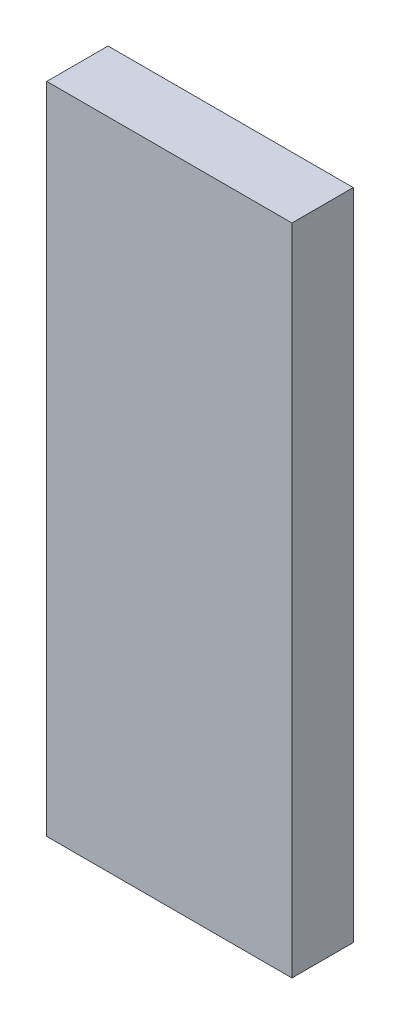
ISO-10303-21;
HEADER;
FILE_DESCRIPTION(('STEP AP214'),'2;1');
FILE_NAME('part.step','',(''),(''),'','','');
FILE_SCHEMA(('AUTOMOTIVE_DESIGN { 1 0 10303 214 1 1 1 1 }'));
ENDSEC;
DATA;
#1=APPLICATION_CONTEXT('core data for automotive mechanical design processes');
#2=APPLICATION_PROTOCOL_DEFINITION('international standard','automotive_design',2000,#1);
#3=PRODUCT_CONTEXT('',#1,'mechanical');
#4=PRODUCT('Part','Part','',(#3));
#5=PRODUCT_RELATED_PRODUCT_CATEGORY('part','',(#4));
#6=PRODUCT_DEFINITION_FORMATION('','',#4);
#7=PRODUCT_DEFINITION_CONTEXT('part definition',#1,'design');
#8=PRODUCT_DEFINITION('design','',#6,#7);
#9=PRODUCT_DEFINITION_SHAPE('','',#8);
#10=(LENGTH_UNIT() NAMED_UNIT(*) SI_UNIT(.MILLI.,.METRE.));
#11=(NAMED_UNIT(*) PLANE_ANGLE_UNIT() SI_UNIT($,.RADIAN.));
#12=(NAMED_UNIT(*) SI_UNIT($,.STERADIAN.) SOLID_ANGLE_UNIT());
#13=UNCERTAINTY_MEASURE_WITH_UNIT(LENGTH_MEASURE(1.E-05),#10,'distance_accuracy_value','');
#14=(GEOMETRIC_REPRESENTATION_CONTEXT(3) GLOBAL_UNCERTAINTY_ASSIGNED_CONTEXT((#13)) GLOBAL_UNIT_ASSIGNED_CONTEXT((#10,
#11,#12)) REPRESENTATION_CONTEXT('',''));
#15=CARTESIAN_POINT('',(0.,0.,0.));
#16=DIRECTION('',(0.,0.,1.));
#17=DIRECTION('',(1.,0.,0.));
#18=AXIS2_PLACEMENT_3D('',#15,#16,#17);
#19=CARTESIAN_POINT('',(62.5858711935384,-164.,3.));
#20=DIRECTION('',(1.,0.,0.));
#21=DIRECTION('',(0.,0.,-1.));
#22=AXIS2_PLACEMENT_3D('',#19,#20,#21);
#23=PLANE('',#22);
#24=DIRECTION('',(0.,-1.,0.));
#25=VECTOR('',#24,1.);
#26=CARTESIAN_POINT('',(62.5858711935384,-164.,0.));
#27=LINE('',#26,#25);
#28=CARTESIAN_POINT('',(62.5858711935384,-164.,0.));
#29=VERTEX_POINT('',#28);
#30=CARTESIAN_POINT('',(62.5858711935384,-196.,0.));
#31=VERTEX_POINT('',#30);
#32=EDGE_CURVE('E96',#29,#31,#27,.T.);
#33=ORIENTED_EDGE('',*,*,#32,.T.);
#34=DIRECTION('',(0.,0.,-1.));
#35=VECTOR('',#34,1.);
#36=CARTESIAN_POINT('',(62.5858711935384,-196.,3.));
#37=LINE('',#36,#35);
#38=CARTESIAN_POINT('',(62.5858711935384,-196.,3.));
#39=VERTEX_POINT('',#38);
#40=EDGE_CURVE('E11',#39,#31,#37,.T.);
#41=ORIENTED_EDGE('',*,*,#40,.F.);
#42=DIRECTION('',(0.,-1.,0.));
#43=VECTOR('',#42,1.);
#44=CARTESIAN_POINT('',(62.5858711935384,-164.,3.));
#45=LINE('',#44,#43);
#46=CARTESIAN_POINT('',(62.5858711935384,-164.,3.));
#47=VERTEX_POINT('',#46);
#48=EDGE_CURVE('E84',#47,#39,#45,.T.);
#49=ORIENTED_EDGE('',*,*,#48,.F.);
#50=DIRECTION('',(0.,0.,-1.));
#51=VECTOR('',#50,1.);
#52=CARTESIAN_POINT('',(62.5858711935384,-164.,3.));
#53=LINE('',#52,#51);
#54=EDGE_CURVE('E92',#47,#29,#53,.T.);
#55=ORIENTED_EDGE('',*,*,#54,.T.);
#56=EDGE_LOOP('',(#33,#41,#49,#55));
#57=FACE_BOUND('',#56,.T.);
#58=ADVANCED_FACE('F33',(#57),#23,.F.);
#59=CARTESIAN_POINT('',(62.5858711935384,-196.,3.));
#60=DIRECTION('',(0.,1.,0.));
#61=DIRECTION('',(0.,0.,1.));
#62=AXIS2_PLACEMENT_3D('',#59,#60,#61);
#63=PLANE('',#62);
#64=DIRECTION('',(1.,0.,0.));
#65=VECTOR('',#64,1.);
#66=CARTESIAN_POINT('',(62.5858711935384,-196.,0.));
#67=LINE('',#66,#65);
#68=CARTESIAN_POINT('',(74.5858711935384,-196.,0.));
#69=VERTEX_POINT('',#68);
#70=EDGE_CURVE('E88',#31,#69,#67,.T.);
#71=ORIENTED_EDGE('',*,*,#70,.T.);
#72=DIRECTION('',(0.,0.,-1.));
#73=VECTOR('',#72,1.);
#74=CARTESIAN_POINT('',(74.5858711935384,-196.,3.));
#75=LINE('',#74,#73);
#76=CARTESIAN_POINT('',(74.5858711935384,-196.,3.));
#77=VERTEX_POINT('',#76);
#78=EDGE_CURVE('E41',#77,#69,#75,.T.);
#79=ORIENTED_EDGE('',*,*,#78,.F.);
#80=DIRECTION('',(1.,0.,0.));
#81=VECTOR('',#80,1.);
#82=CARTESIAN_POINT('',(62.5858711935384,-196.,3.));
#83=LINE('',#82,#81);
#84=EDGE_CURVE('E79',#39,#77,#83,.T.);
#85=ORIENTED_EDGE('',*,*,#84,.F.);
#86=ORIENTED_EDGE('',*,*,#40,.T.);
#87=EDGE_LOOP('',(#71,#79,#85,#86));
#88=FACE_BOUND('',#87,.T.);
#89=ADVANCED_FACE('F87',(#88),#63,.F.);
#90=CARTESIAN_POINT('',(74.5858711935384,-164.,3.));
#91=DIRECTION('',(-1.,0.,0.));
#92=DIRECTION('',(0.,-1.,0.));
#93=AXIS2_PLACEMENT_3D('',#90,#91,#92);
#94=PLANE('',#93);
#95=DIRECTION('',(0.,1.,0.));
#96=VECTOR('',#95,1.);
#97=CARTESIAN_POINT('',(74.5858711935384,-164.,0.));
#98=LINE('',#97,#96);
#99=CARTESIAN_POINT('',(74.5858711935384,-164.,0.));
#100=VERTEX_POINT('',#99);
#101=EDGE_CURVE('E66',#69,#100,#98,.T.);
#102=ORIENTED_EDGE('',*,*,#101,.T.);
#103=DIRECTION('',(0.,0.,-1.));
#104=VECTOR('',#103,1.);
#105=CARTESIAN_POINT('',(74.5858711935384,-164.,3.));
#106=LINE('',#105,#104);
#107=CARTESIAN_POINT('',(74.5858711935384,-164.,3.));
#108=VERTEX_POINT('',#107);
#109=EDGE_CURVE('E89',#108,#100,#106,.T.);
#110=ORIENTED_EDGE('',*,*,#109,.F.);
#111=DIRECTION('',(0.,1.,0.));
#112=VECTOR('',#111,1.);
#113=CARTESIAN_POINT('',(74.5858711935384,-164.,3.));
#114=LINE('',#113,#112);
#115=EDGE_CURVE('E82',#77,#108,#114,.T.);
#116=ORIENTED_EDGE('',*,*,#115,.F.);
#117=ORIENTED_EDGE('',*,*,#78,.T.);
#118=EDGE_LOOP('',(#102,#110,#116,#117));
#119=FACE_BOUND('',#118,.T.);
#120=ADVANCED_FACE('F90',(#119),#94,.F.);
#121=CARTESIAN_POINT('',(62.5858711935384,-164.,3.));
#122=DIRECTION('',(0.,-1.,0.));
#123=DIRECTION('',(0.,0.,-1.));
#124=AXIS2_PLACEMENT_3D('',#121,#122,#123);
#125=PLANE('',#124);
#126=DIRECTION('',(-1.,0.,0.));
#127=VECTOR('',#126,1.);
#128=CARTESIAN_POINT('',(62.5858711935384,-164.,0.));
#129=LINE('',#128,#127);
#130=EDGE_CURVE('E72',#100,#29,#129,.T.);
#131=ORIENTED_EDGE('',*,*,#130,.T.);
#132=ORIENTED_EDGE('',*,*,#54,.F.);
#133=DIRECTION('',(-1.,0.,0.));
#134=VECTOR('',#133,1.);
#135=CARTESIAN_POINT('',(62.5858711935384,-164.,3.));
#136=LINE('',#135,#134);
#137=EDGE_CURVE('E49',#108,#47,#136,.T.);
#138=ORIENTED_EDGE('',*,*,#137,.F.);
#139=ORIENTED_EDGE('',*,*,#109,.T.);
#140=EDGE_LOOP('',(#131,#132,#138,#139));
#141=FACE_BOUND('',#140,.T.);
#142=ADVANCED_FACE('F103',(#141),#125,.F.);
#143=CARTESIAN_POINT('',(0.,0.,3.));
#144=DIRECTION('',(0.,0.,1.));
#145=DIRECTION('',(1.,0.,0.));
#146=AXIS2_PLACEMENT_3D('',#143,#144,#145);
#147=PLANE('',#146);
#148=ORIENTED_EDGE('',*,*,#48,.T.);
#149=ORIENTED_EDGE('',*,*,#84,.T.);
#150=ORIENTED_EDGE('',*,*,#115,.T.);
#151=ORIENTED_EDGE('',*,*,#137,.T.);
#152=EDGE_LOOP('',(#148,#149,#150,#151));
#153=FACE_BOUND('',#152,.T.);
#154=ADVANCED_FACE('F80',(#153),#147,.T.);
#155=CARTESIAN_POINT('',(0.,0.,0.));
#156=DIRECTION('',(0.,0.,1.));
#157=DIRECTION('',(1.,0.,0.));
#158=AXIS2_PLACEMENT_3D('',#155,#156,#157);
#159=PLANE('',#158);
#160=ORIENTED_EDGE('',*,*,#32,.F.);
#161=ORIENTED_EDGE('',*,*,#130,.F.);
#162=ORIENTED_EDGE('',*,*,#101,.F.);
#163=ORIENTED_EDGE('',*,*,#70,.F.);
#164=EDGE_LOOP('',(#160,#161,#162,#163));
#165=FACE_BOUND('',#164,.T.);
#166=ADVANCED_FACE('F106',(#165),#159,.F.);
#167=CLOSED_SHELL('',(#58,#89,#120,#142,#154,#166));
#168=MANIFOLD_SOLID_BREP('B2',#167);
#169=ADVANCED_BREP_SHAPE_REPRESENTATION('',(#18,#168),#14);
#170=SHAPE_DEFINITION_REPRESENTATION(#9,#169);
ENDSEC;
END-ISO-10303-21;
